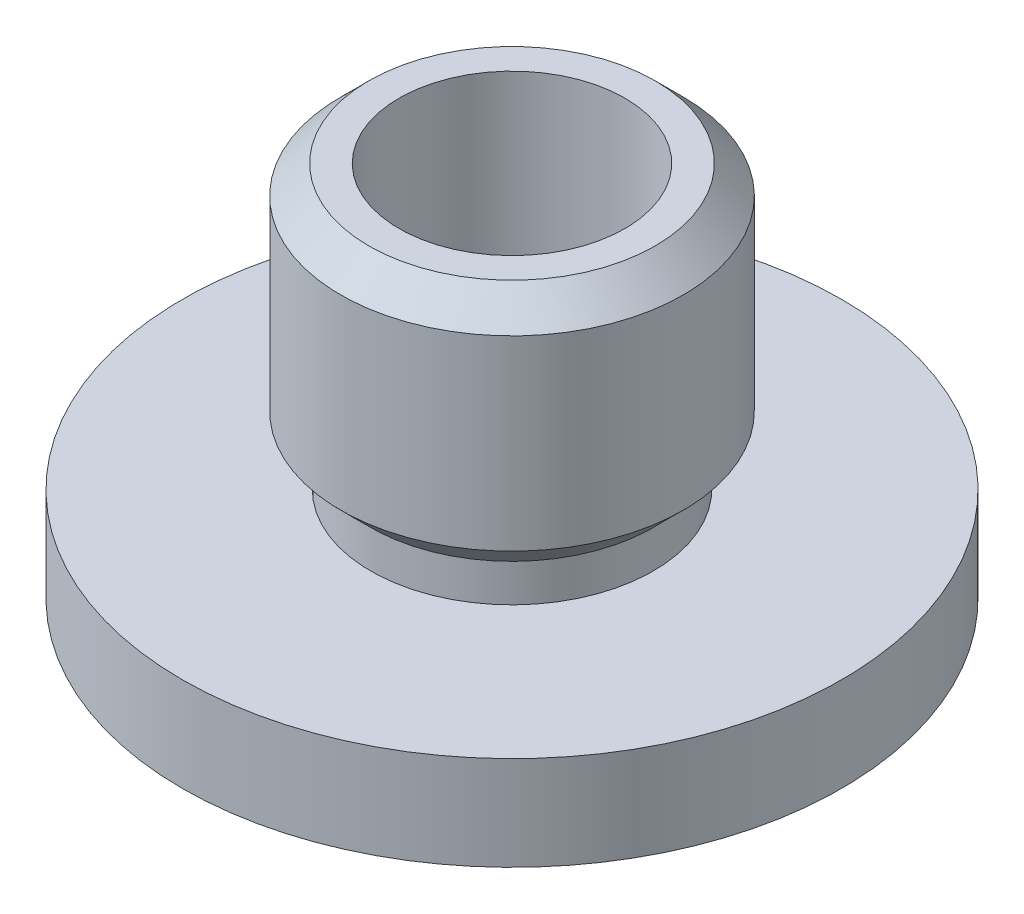
ISO-10303-21;
HEADER;
FILE_DESCRIPTION(('STEP AP214'),'2;1');
FILE_NAME('part.step','',(''),(''),'','','');
FILE_SCHEMA(('AUTOMOTIVE_DESIGN { 1 0 10303 214 1 1 1 1 }'));
ENDSEC;
DATA;
#1=APPLICATION_CONTEXT('core data for automotive mechanical design processes');
#2=APPLICATION_PROTOCOL_DEFINITION('international standard','automotive_design',2000,#1);
#3=PRODUCT_CONTEXT('',#1,'mechanical');
#4=PRODUCT('Part','Part','',(#3));
#5=PRODUCT_RELATED_PRODUCT_CATEGORY('part','',(#4));
#6=PRODUCT_DEFINITION_FORMATION('','',#4);
#7=PRODUCT_DEFINITION_CONTEXT('part definition',#1,'design');
#8=PRODUCT_DEFINITION('design','',#6,#7);
#9=PRODUCT_DEFINITION_SHAPE('','',#8);
#10=(LENGTH_UNIT() NAMED_UNIT(*) SI_UNIT(.MILLI.,.METRE.));
#11=(NAMED_UNIT(*) PLANE_ANGLE_UNIT() SI_UNIT($,.RADIAN.));
#12=(NAMED_UNIT(*) SI_UNIT($,.STERADIAN.) SOLID_ANGLE_UNIT());
#13=UNCERTAINTY_MEASURE_WITH_UNIT(LENGTH_MEASURE(1.E-05),#10,'distance_accuracy_value','');
#14=(GEOMETRIC_REPRESENTATION_CONTEXT(3) GLOBAL_UNCERTAINTY_ASSIGNED_CONTEXT((#13)) GLOBAL_UNIT_ASSIGNED_CONTEXT((#10,
#11,#12)) REPRESENTATION_CONTEXT('',''));
#15=CARTESIAN_POINT('',(0.,0.,0.));
#16=DIRECTION('',(0.,0.,1.));
#17=DIRECTION('',(1.,0.,0.));
#18=AXIS2_PLACEMENT_3D('',#15,#16,#17);
#19=CARTESIAN_POINT('',(0.,-65.9597326463728,0.));
#20=DIRECTION('',(0.,-1.,0.));
#21=DIRECTION('',(0.,0.,-1.));
#22=AXIS2_PLACEMENT_3D('',#19,#20,#21);
#23=CYLINDRICAL_SURFACE('',#22,17.5);
#24=CARTESIAN_POINT('',(0.,-15.,0.));
#25=DIRECTION('',(0.,-1.,0.));
#26=DIRECTION('',(0.,0.,-1.));
#27=AXIS2_PLACEMENT_3D('',#24,#25,#26);
#28=CIRCLE('',#27,17.5);
#29=CARTESIAN_POINT('',(0.,-15.,-17.5));
#30=VERTEX_POINT('',#29);
#31=EDGE_CURVE('E62',#30,#30,#28,.T.);
#32=ORIENTED_EDGE('',*,*,#31,.T.);
#33=EDGE_LOOP('',(#32));
#34=FACE_BOUND('',#33,.T.);
#35=CARTESIAN_POINT('',(0.,-20.,0.));
#36=DIRECTION('',(0.,-1.,0.));
#37=DIRECTION('',(0.,0.,-1.));
#38=AXIS2_PLACEMENT_3D('',#35,#36,#37);
#39=CIRCLE('',#38,17.5);
#40=CARTESIAN_POINT('',(0.,-20.,-17.5));
#41=VERTEX_POINT('',#40);
#42=EDGE_CURVE('E10',#41,#41,#39,.T.);
#43=ORIENTED_EDGE('',*,*,#42,.F.);
#44=EDGE_LOOP('',(#43));
#45=FACE_BOUND('',#44,.T.);
#46=ADVANCED_FACE('F31',(#34,#45),#23,.T.);
#47=CARTESIAN_POINT('',(17.5,-20.,0.));
#48=DIRECTION('',(0.,-1.,0.));
#49=DIRECTION('',(0.,0.,-1.));
#50=AXIS2_PLACEMENT_3D('',#47,#48,#49);
#51=PLANE('',#50);
#52=ORIENTED_EDGE('',*,*,#42,.T.);
#53=EDGE_LOOP('',(#52));
#54=FACE_BOUND('',#53,.T.);
#55=CARTESIAN_POINT('',(0.,-20.,0.));
#56=DIRECTION('',(0.,-1.,0.));
#57=DIRECTION('',(0.,0.,-1.));
#58=AXIS2_PLACEMENT_3D('',#55,#56,#57);
#59=CIRCLE('',#58,6.);
#60=CARTESIAN_POINT('',(0.,-20.,-6.));
#61=VERTEX_POINT('',#60);
#62=EDGE_CURVE('E37',#61,#61,#59,.T.);
#63=ORIENTED_EDGE('',*,*,#62,.F.);
#64=EDGE_LOOP('',(#63));
#65=FACE_BOUND('',#64,.T.);
#66=ADVANCED_FACE('F80',(#54,#65),#51,.T.);
#67=CARTESIAN_POINT('',(0.,-65.9597326463728,0.));
#68=DIRECTION('',(0.,-1.,0.));
#69=DIRECTION('',(0.,0.,-1.));
#70=AXIS2_PLACEMENT_3D('',#67,#68,#69);
#71=CYLINDRICAL_SURFACE('',#70,6.);
#72=ORIENTED_EDGE('',*,*,#62,.T.);
#73=EDGE_LOOP('',(#72));
#74=FACE_BOUND('',#73,.T.);
#75=CARTESIAN_POINT('',(0.,0.,0.));
#76=DIRECTION('',(0.,-1.,0.));
#77=DIRECTION('',(0.,0.,-1.));
#78=AXIS2_PLACEMENT_3D('',#75,#76,#77);
#79=CIRCLE('',#78,6.);
#80=CARTESIAN_POINT('',(0.,0.,-6.));
#81=VERTEX_POINT('',#80);
#82=EDGE_CURVE('E41',#81,#81,#79,.T.);
#83=ORIENTED_EDGE('',*,*,#82,.F.);
#84=EDGE_LOOP('',(#83));
#85=FACE_BOUND('',#84,.T.);
#86=ADVANCED_FACE('F84',(#74,#85),#71,.F.);
#87=CARTESIAN_POINT('',(6.,0.,0.));
#88=DIRECTION('',(0.,1.,0.));
#89=DIRECTION('',(0.,0.,1.));
#90=AXIS2_PLACEMENT_3D('',#87,#88,#89);
#91=PLANE('',#90);
#92=ORIENTED_EDGE('',*,*,#82,.T.);
#93=EDGE_LOOP('',(#92));
#94=FACE_BOUND('',#93,.T.);
#95=CARTESIAN_POINT('',(0.,0.,0.));
#96=DIRECTION('',(0.,-1.,0.));
#97=DIRECTION('',(0.,0.,-1.));
#98=AXIS2_PLACEMENT_3D('',#95,#96,#97);
#99=CIRCLE('',#98,7.6);
#100=CARTESIAN_POINT('',(0.,0.,-7.6));
#101=VERTEX_POINT('',#100);
#102=EDGE_CURVE('E45',#101,#101,#99,.T.);
#103=ORIENTED_EDGE('',*,*,#102,.F.);
#104=EDGE_LOOP('',(#103));
#105=FACE_BOUND('',#104,.T.);
#106=ADVANCED_FACE('F88',(#94,#105),#91,.T.);
#107=CARTESIAN_POINT('',(0.,-1.5,0.));
#108=DIRECTION('',(0.,-1.,0.));
#109=DIRECTION('',(0.,0.,-1.));
#110=AXIS2_PLACEMENT_3D('',#107,#108,#109);
#111=CONICAL_SURFACE('',#110,9.1,0.785398163397447);
#112=ORIENTED_EDGE('',*,*,#102,.T.);
#113=EDGE_LOOP('',(#112));
#114=FACE_BOUND('',#113,.T.);
#115=CARTESIAN_POINT('',(0.,-1.5,0.));
#116=DIRECTION('',(0.,-1.,0.));
#117=DIRECTION('',(0.,0.,-1.));
#118=AXIS2_PLACEMENT_3D('',#115,#116,#117);
#119=CIRCLE('',#118,9.1);
#120=CARTESIAN_POINT('',(0.,-1.5,-9.1));
#121=VERTEX_POINT('',#120);
#122=EDGE_CURVE('E50',#121,#121,#119,.T.);
#123=ORIENTED_EDGE('',*,*,#122,.F.);
#124=EDGE_LOOP('',(#123));
#125=FACE_BOUND('',#124,.T.);
#126=ADVANCED_FACE('F94',(#114,#125),#111,.T.);
#127=CARTESIAN_POINT('',(0.,-65.9597326463728,0.));
#128=DIRECTION('',(0.,-1.,0.));
#129=DIRECTION('',(0.,0.,-1.));
#130=AXIS2_PLACEMENT_3D('',#127,#128,#129);
#131=CYLINDRICAL_SURFACE('',#130,9.1);
#132=ORIENTED_EDGE('',*,*,#122,.T.);
#133=EDGE_LOOP('',(#132));
#134=FACE_BOUND('',#133,.T.);
#135=CARTESIAN_POINT('',(0.,-11.4,0.));
#136=DIRECTION('',(0.,-1.,0.));
#137=DIRECTION('',(0.,0.,-1.));
#138=AXIS2_PLACEMENT_3D('',#135,#136,#137);
#139=CIRCLE('',#138,9.1);
#140=CARTESIAN_POINT('',(0.,-11.4,-9.1));
#141=VERTEX_POINT('',#140);
#142=EDGE_CURVE('E53',#141,#141,#139,.T.);
#143=ORIENTED_EDGE('',*,*,#142,.F.);
#144=EDGE_LOOP('',(#143));
#145=FACE_BOUND('',#144,.T.);
#146=ADVANCED_FACE('F98',(#134,#145),#131,.T.);
#147=CARTESIAN_POINT('',(0.,-13.,0.));
#148=DIRECTION('',(0.,1.,0.));
#149=DIRECTION('',(0.,0.,1.));
#150=AXIS2_PLACEMENT_3D('',#147,#148,#149);
#151=CONICAL_SURFACE('',#150,7.5,0.78539816339745);
#152=ORIENTED_EDGE('',*,*,#142,.T.);
#153=EDGE_LOOP('',(#152));
#154=FACE_BOUND('',#153,.T.);
#155=CARTESIAN_POINT('',(0.,-13.,0.));
#156=DIRECTION('',(0.,-1.,0.));
#157=DIRECTION('',(0.,0.,-1.));
#158=AXIS2_PLACEMENT_3D('',#155,#156,#157);
#159=CIRCLE('',#158,7.5);
#160=CARTESIAN_POINT('',(0.,-13.,-7.5));
#161=VERTEX_POINT('',#160);
#162=EDGE_CURVE('E56',#161,#161,#159,.T.);
#163=ORIENTED_EDGE('',*,*,#162,.F.);
#164=EDGE_LOOP('',(#163));
#165=FACE_BOUND('',#164,.T.);
#166=ADVANCED_FACE('F76',(#154,#165),#151,.T.);
#167=CARTESIAN_POINT('',(0.,-65.9597326463728,0.));
#168=DIRECTION('',(0.,-1.,0.));
#169=DIRECTION('',(0.,0.,-1.));
#170=AXIS2_PLACEMENT_3D('',#167,#168,#169);
#171=CYLINDRICAL_SURFACE('',#170,7.5);
#172=ORIENTED_EDGE('',*,*,#162,.T.);
#173=EDGE_LOOP('',(#172));
#174=FACE_BOUND('',#173,.T.);
#175=CARTESIAN_POINT('',(0.,-15.,0.));
#176=DIRECTION('',(0.,-1.,0.));
#177=DIRECTION('',(0.,0.,-1.));
#178=AXIS2_PLACEMENT_3D('',#175,#176,#177);
#179=CIRCLE('',#178,7.5);
#180=CARTESIAN_POINT('',(0.,-15.,-7.5));
#181=VERTEX_POINT('',#180);
#182=EDGE_CURVE('E59',#181,#181,#179,.T.);
#183=ORIENTED_EDGE('',*,*,#182,.F.);
#184=EDGE_LOOP('',(#183));
#185=FACE_BOUND('',#184,.T.);
#186=ADVANCED_FACE('F70',(#174,#185),#171,.T.);
#187=CARTESIAN_POINT('',(7.5,-15.,0.));
#188=DIRECTION('',(0.,1.,0.));
#189=DIRECTION('',(0.,0.,1.));
#190=AXIS2_PLACEMENT_3D('',#187,#188,#189);
#191=PLANE('',#190);
#192=ORIENTED_EDGE('',*,*,#182,.T.);
#193=EDGE_LOOP('',(#192));
#194=FACE_BOUND('',#193,.T.);
#195=ORIENTED_EDGE('',*,*,#31,.F.);
#196=EDGE_LOOP('',(#195));
#197=FACE_BOUND('',#196,.T.);
#198=ADVANCED_FACE('F68',(#194,#197),#191,.T.);
#199=CLOSED_SHELL('',(#46,#66,#86,#106,#126,#146,#166,#186,#198));
#200=MANIFOLD_SOLID_BREP('B2',#199);
#201=ADVANCED_BREP_SHAPE_REPRESENTATION('',(#18,#200),#14);
#202=SHAPE_DEFINITION_REPRESENTATION(#9,#201);
ENDSEC;
END-ISO-10303-21;
